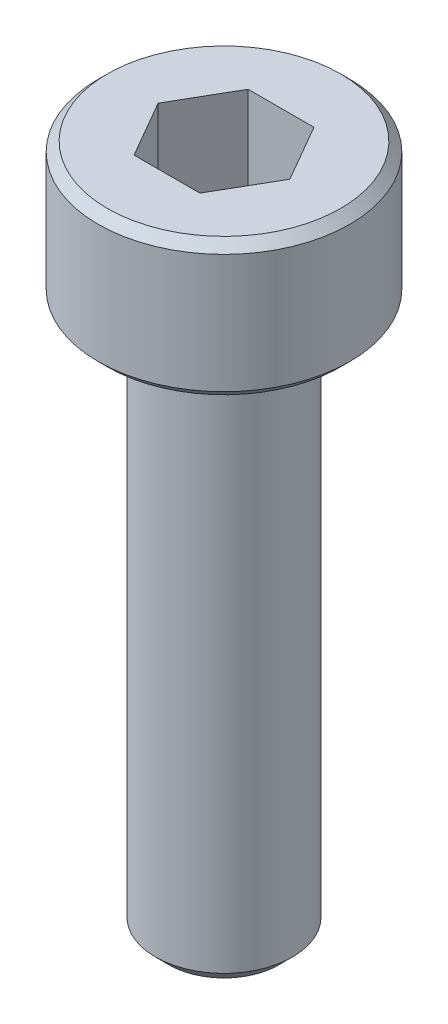
ISO-10303-21;
HEADER;
FILE_DESCRIPTION(('STEP AP214'),'2;1');
FILE_NAME('part.step','',(''),(''),'','','');
FILE_SCHEMA(('AUTOMOTIVE_DESIGN { 1 0 10303 214 1 1 1 1 }'));
ENDSEC;
DATA;
#1=APPLICATION_CONTEXT('core data for automotive mechanical design processes');
#2=APPLICATION_PROTOCOL_DEFINITION('international standard','automotive_design',2000,#1);
#3=PRODUCT_CONTEXT('',#1,'mechanical');
#4=PRODUCT('Part','Part','',(#3));
#5=PRODUCT_RELATED_PRODUCT_CATEGORY('part','',(#4));
#6=PRODUCT_DEFINITION_FORMATION('','',#4);
#7=PRODUCT_DEFINITION_CONTEXT('part definition',#1,'design');
#8=PRODUCT_DEFINITION('design','',#6,#7);
#9=PRODUCT_DEFINITION_SHAPE('','',#8);
#10=(LENGTH_UNIT() NAMED_UNIT(*) SI_UNIT(.MILLI.,.METRE.));
#11=(NAMED_UNIT(*) PLANE_ANGLE_UNIT() SI_UNIT($,.RADIAN.));
#12=(NAMED_UNIT(*) SI_UNIT($,.STERADIAN.) SOLID_ANGLE_UNIT());
#13=UNCERTAINTY_MEASURE_WITH_UNIT(LENGTH_MEASURE(1.E-05),#10,'distance_accuracy_value','');
#14=(GEOMETRIC_REPRESENTATION_CONTEXT(3) GLOBAL_UNCERTAINTY_ASSIGNED_CONTEXT((#13)) GLOBAL_UNIT_ASSIGNED_CONTEXT((#10,
#11,#12)) REPRESENTATION_CONTEXT('',''));
#15=CARTESIAN_POINT('',(0.,0.,0.));
#16=DIRECTION('',(0.,0.,1.));
#17=DIRECTION('',(1.,0.,0.));
#18=AXIS2_PLACEMENT_3D('',#15,#16,#17);
#19=CARTESIAN_POINT('',(1.5,-12.,0.));
#20=DIRECTION('',(0.,1.,0.));
#21=DIRECTION('',(0.,0.,1.));
#22=AXIS2_PLACEMENT_3D('',#19,#20,#21);
#23=PLANE('',#22);
#24=CARTESIAN_POINT('',(0.,-12.,0.));
#25=DIRECTION('',(0.,1.,0.));
#26=DIRECTION('',(0.,0.,1.));
#27=AXIS2_PLACEMENT_3D('',#24,#25,#26);
#28=CIRCLE('',#27,1.2);
#29=CARTESIAN_POINT('',(0.,-12.,1.2));
#30=VERTEX_POINT('',#29);
#31=EDGE_CURVE('E11',#30,#30,#28,.F.);
#32=ORIENTED_EDGE('',*,*,#31,.T.);
#33=EDGE_LOOP('',(#32));
#34=FACE_BOUND('',#33,.T.);
#35=ADVANCED_FACE('F41',(#34),#23,.F.);
#36=CARTESIAN_POINT('',(0.,3.,0.));
#37=DIRECTION('',(0.,1.,0.));
#38=DIRECTION('',(0.,0.,1.));
#39=AXIS2_PLACEMENT_3D('',#36,#37,#38);
#40=CYLINDRICAL_SURFACE('',#39,1.5);
#41=CARTESIAN_POINT('',(0.,-11.7,0.));
#42=DIRECTION('',(0.,1.,0.));
#43=DIRECTION('',(0.,0.,1.));
#44=AXIS2_PLACEMENT_3D('',#41,#42,#43);
#45=CIRCLE('',#44,1.5);
#46=CARTESIAN_POINT('',(0.,-11.7,1.5));
#47=VERTEX_POINT('',#46);
#48=EDGE_CURVE('E51',#47,#47,#45,.T.);
#49=ORIENTED_EDGE('',*,*,#48,.T.);
#50=EDGE_LOOP('',(#49));
#51=FACE_BOUND('',#50,.T.);
#52=CARTESIAN_POINT('',(0.,0.,0.));
#53=DIRECTION('',(0.,1.,0.));
#54=DIRECTION('',(0.,0.,1.));
#55=AXIS2_PLACEMENT_3D('',#52,#53,#54);
#56=CIRCLE('',#55,1.5);
#57=CARTESIAN_POINT('',(0.,0.,1.5));
#58=VERTEX_POINT('',#57);
#59=EDGE_CURVE('E157',#58,#58,#56,.T.);
#60=ORIENTED_EDGE('',*,*,#59,.F.);
#61=EDGE_LOOP('',(#60));
#62=FACE_BOUND('',#61,.T.);
#63=ADVANCED_FACE('F189',(#51,#62),#40,.T.);
#64=CARTESIAN_POINT('',(1.5,0.,0.));
#65=DIRECTION('',(0.,1.,0.));
#66=DIRECTION('',(0.,0.,1.));
#67=AXIS2_PLACEMENT_3D('',#64,#65,#66);
#68=PLANE('',#67);
#69=CARTESIAN_POINT('',(0.,0.,0.));
#70=DIRECTION('',(0.,1.,0.));
#71=DIRECTION('',(0.,0.,1.));
#72=AXIS2_PLACEMENT_3D('',#69,#70,#71);
#73=CIRCLE('',#72,2.55);
#74=CARTESIAN_POINT('',(0.,0.,2.55));
#75=VERTEX_POINT('',#74);
#76=EDGE_CURVE('E178',#75,#75,#73,.F.);
#77=ORIENTED_EDGE('',*,*,#76,.T.);
#78=EDGE_LOOP('',(#77));
#79=FACE_BOUND('',#78,.T.);
#80=ORIENTED_EDGE('',*,*,#59,.T.);
#81=EDGE_LOOP('',(#80));
#82=FACE_BOUND('',#81,.T.);
#83=ADVANCED_FACE('F211',(#79,#82),#68,.F.);
#84=CARTESIAN_POINT('',(0.,3.,0.));
#85=DIRECTION('',(0.,1.,0.));
#86=DIRECTION('',(0.,0.,1.));
#87=AXIS2_PLACEMENT_3D('',#84,#85,#86);
#88=CYLINDRICAL_SURFACE('',#87,2.75);
#89=CARTESIAN_POINT('',(0.,0.199999999999999,0.));
#90=DIRECTION('',(0.,1.,0.));
#91=DIRECTION('',(0.,0.,1.));
#92=AXIS2_PLACEMENT_3D('',#89,#90,#91);
#93=CIRCLE('',#92,2.75);
#94=CARTESIAN_POINT('',(0.,0.199999999999999,2.75));
#95=VERTEX_POINT('',#94);
#96=EDGE_CURVE('E174',#95,#95,#93,.T.);
#97=ORIENTED_EDGE('',*,*,#96,.T.);
#98=EDGE_LOOP('',(#97));
#99=FACE_BOUND('',#98,.T.);
#100=CARTESIAN_POINT('',(0.,2.8,0.));
#101=DIRECTION('',(0.,-1.,0.));
#102=DIRECTION('',(0.,0.,-1.));
#103=AXIS2_PLACEMENT_3D('',#100,#101,#102);
#104=CIRCLE('',#103,2.75);
#105=CARTESIAN_POINT('',(0.,2.8,-2.75));
#106=VERTEX_POINT('',#105);
#107=EDGE_CURVE('E170',#106,#106,#104,.T.);
#108=ORIENTED_EDGE('',*,*,#107,.T.);
#109=EDGE_LOOP('',(#108));
#110=FACE_BOUND('',#109,.T.);
#111=ADVANCED_FACE('F229',(#99,#110),#88,.T.);
#112=CARTESIAN_POINT('',(2.75,3.,0.));
#113=DIRECTION('',(0.,-1.,0.));
#114=DIRECTION('',(0.,0.,-1.));
#115=AXIS2_PLACEMENT_3D('',#112,#113,#114);
#116=PLANE('',#115);
#117=DIRECTION('',(0.5,0.,0.866025403784439));
#118=VECTOR('',#117,1.);
#119=CARTESIAN_POINT('',(-0.72,3.,1.24707658144959));
#120=LINE('',#119,#118);
#121=CARTESIAN_POINT('',(-1.44,3.,0.));
#122=VERTEX_POINT('',#121);
#123=CARTESIAN_POINT('',(-0.72,3.,1.24707658144959));
#124=VERTEX_POINT('',#123);
#125=EDGE_CURVE('E138',#122,#124,#120,.T.);
#126=ORIENTED_EDGE('',*,*,#125,.F.);
#127=DIRECTION('',(-0.5,0.,0.866025403784439));
#128=VECTOR('',#127,1.);
#129=CARTESIAN_POINT('',(-1.44,3.,0.));
#130=LINE('',#129,#128);
#131=CARTESIAN_POINT('',(-0.72,3.,-1.24707658144959));
#132=VERTEX_POINT('',#131);
#133=EDGE_CURVE('E58',#132,#122,#130,.T.);
#134=ORIENTED_EDGE('',*,*,#133,.F.);
#135=DIRECTION('',(-1.,0.,0.));
#136=VECTOR('',#135,1.);
#137=CARTESIAN_POINT('',(-0.72,3.,-1.24707658144959));
#138=LINE('',#137,#136);
#139=CARTESIAN_POINT('',(0.72,3.,-1.24707658144959));
#140=VERTEX_POINT('',#139);
#141=EDGE_CURVE('E151',#140,#132,#138,.T.);
#142=ORIENTED_EDGE('',*,*,#141,.F.);
#143=DIRECTION('',(-0.5,0.,-0.866025403784439));
#144=VECTOR('',#143,1.);
#145=CARTESIAN_POINT('',(0.72,3.,-1.24707658144959));
#146=LINE('',#145,#144);
#147=CARTESIAN_POINT('',(1.44,3.,0.));
#148=VERTEX_POINT('',#147);
#149=EDGE_CURVE('E148',#148,#140,#146,.T.);
#150=ORIENTED_EDGE('',*,*,#149,.F.);
#151=DIRECTION('',(0.5,0.,-0.866025403784439));
#152=VECTOR('',#151,1.);
#153=CARTESIAN_POINT('',(1.44,3.,0.));
#154=LINE('',#153,#152);
#155=CARTESIAN_POINT('',(0.72,3.,1.24707658144959));
#156=VERTEX_POINT('',#155);
#157=EDGE_CURVE('E106',#156,#148,#154,.T.);
#158=ORIENTED_EDGE('',*,*,#157,.F.);
#159=DIRECTION('',(1.,0.,0.));
#160=VECTOR('',#159,1.);
#161=CARTESIAN_POINT('',(0.72,3.,1.24707658144959));
#162=LINE('',#161,#160);
#163=EDGE_CURVE('E142',#124,#156,#162,.T.);
#164=ORIENTED_EDGE('',*,*,#163,.F.);
#165=EDGE_LOOP('',(#126,#134,#142,#150,#158,#164));
#166=FACE_BOUND('',#165,.T.);
#167=CARTESIAN_POINT('',(0.,3.,0.));
#168=DIRECTION('',(0.,-1.,0.));
#169=DIRECTION('',(0.,0.,-1.));
#170=AXIS2_PLACEMENT_3D('',#167,#168,#169);
#171=CIRCLE('',#170,2.55);
#172=CARTESIAN_POINT('',(0.,3.,-2.55));
#173=VERTEX_POINT('',#172);
#174=EDGE_CURVE('E182',#173,#173,#171,.F.);
#175=ORIENTED_EDGE('',*,*,#174,.T.);
#176=EDGE_LOOP('',(#175));
#177=FACE_BOUND('',#176,.T.);
#178=ADVANCED_FACE('F220',(#166,#177),#116,.F.);
#179=CARTESIAN_POINT('',(0.,0.199999999999999,0.));
#180=DIRECTION('',(0.,1.,0.));
#181=DIRECTION('',(0.,0.,1.));
#182=AXIS2_PLACEMENT_3D('',#179,#180,#181);
#183=CONICAL_SURFACE('',#182,2.75,0.785398163397446);
#184=ORIENTED_EDGE('',*,*,#76,.F.);
#185=EDGE_LOOP('',(#184));
#186=FACE_BOUND('',#185,.T.);
#187=ORIENTED_EDGE('',*,*,#96,.F.);
#188=EDGE_LOOP('',(#187));
#189=FACE_BOUND('',#188,.T.);
#190=ADVANCED_FACE('F202',(#186,#189),#183,.T.);
#191=CARTESIAN_POINT('',(0.,3.,0.));
#192=DIRECTION('',(0.,-1.,0.));
#193=DIRECTION('',(0.,0.,-1.));
#194=AXIS2_PLACEMENT_3D('',#191,#192,#193);
#195=CONICAL_SURFACE('',#194,2.55,0.785398163397446);
#196=ORIENTED_EDGE('',*,*,#107,.F.);
#197=EDGE_LOOP('',(#196));
#198=FACE_BOUND('',#197,.T.);
#199=ORIENTED_EDGE('',*,*,#174,.F.);
#200=EDGE_LOOP('',(#199));
#201=FACE_BOUND('',#200,.T.);
#202=ADVANCED_FACE('F194',(#198,#201),#195,.T.);
#203=CARTESIAN_POINT('',(0.,-11.7,0.));
#204=DIRECTION('',(0.,1.,0.));
#205=DIRECTION('',(0.,0.,1.));
#206=AXIS2_PLACEMENT_3D('',#203,#204,#205);
#207=CONICAL_SURFACE('',#206,1.5,0.785398163397454);
#208=ORIENTED_EDGE('',*,*,#31,.F.);
#209=EDGE_LOOP('',(#208));
#210=FACE_BOUND('',#209,.T.);
#211=ORIENTED_EDGE('',*,*,#48,.F.);
#212=EDGE_LOOP('',(#211));
#213=FACE_BOUND('',#212,.T.);
#214=ADVANCED_FACE('F44',(#210,#213),#207,.T.);
#215=CARTESIAN_POINT('',(-1.44,0.5,0.));
#216=DIRECTION('',(-0.866025403784439,0.,-0.5));
#217=DIRECTION('',(-0.5,0.,0.866025403784439));
#218=AXIS2_PLACEMENT_3D('',#215,#216,#217);
#219=PLANE('',#218);
#220=ORIENTED_EDGE('',*,*,#133,.T.);
#221=DIRECTION('',(0.,1.,0.));
#222=VECTOR('',#221,1.);
#223=CARTESIAN_POINT('',(-1.44,0.5,0.));
#224=LINE('',#223,#222);
#225=CARTESIAN_POINT('',(-1.44,0.5,0.));
#226=VERTEX_POINT('',#225);
#227=EDGE_CURVE('E88',#226,#122,#224,.T.);
#228=ORIENTED_EDGE('',*,*,#227,.F.);
#229=DIRECTION('',(-0.5,0.,0.866025403784439));
#230=VECTOR('',#229,1.);
#231=CARTESIAN_POINT('',(-1.44,0.5,0.));
#232=LINE('',#231,#230);
#233=CARTESIAN_POINT('',(-0.72,0.5,-1.24707658144959));
#234=VERTEX_POINT('',#233);
#235=EDGE_CURVE('E154',#234,#226,#232,.T.);
#236=ORIENTED_EDGE('',*,*,#235,.F.);
#237=DIRECTION('',(0.,1.,0.));
#238=VECTOR('',#237,1.);
#239=CARTESIAN_POINT('',(-0.72,0.5,-1.24707658144959));
#240=LINE('',#239,#238);
#241=EDGE_CURVE('E66',#234,#132,#240,.T.);
#242=ORIENTED_EDGE('',*,*,#241,.T.);
#243=EDGE_LOOP('',(#220,#228,#236,#242));
#244=FACE_BOUND('',#243,.T.);
#245=ADVANCED_FACE('F193',(#244),#219,.F.);
#246=CARTESIAN_POINT('',(-0.72,0.5,-1.24707658144959));
#247=DIRECTION('',(0.,0.,-1.));
#248=DIRECTION('',(-1.,0.,0.));
#249=AXIS2_PLACEMENT_3D('',#246,#247,#248);
#250=PLANE('',#249);
#251=ORIENTED_EDGE('',*,*,#141,.T.);
#252=ORIENTED_EDGE('',*,*,#241,.F.);
#253=DIRECTION('',(-1.,0.,0.));
#254=VECTOR('',#253,1.);
#255=CARTESIAN_POINT('',(-0.72,0.5,-1.24707658144959));
#256=LINE('',#255,#254);
#257=CARTESIAN_POINT('',(0.72,0.5,-1.24707658144959));
#258=VERTEX_POINT('',#257);
#259=EDGE_CURVE('E120',#258,#234,#256,.T.);
#260=ORIENTED_EDGE('',*,*,#259,.F.);
#261=DIRECTION('',(0.,1.,0.));
#262=VECTOR('',#261,1.);
#263=CARTESIAN_POINT('',(0.72,0.5,-1.24707658144959));
#264=LINE('',#263,#262);
#265=EDGE_CURVE('E111',#258,#140,#264,.T.);
#266=ORIENTED_EDGE('',*,*,#265,.T.);
#267=EDGE_LOOP('',(#251,#252,#260,#266));
#268=FACE_BOUND('',#267,.T.);
#269=ADVANCED_FACE('F200',(#268),#250,.F.);
#270=CARTESIAN_POINT('',(0.72,0.5,-1.24707658144959));
#271=DIRECTION('',(0.866025403784439,0.,-0.5));
#272=DIRECTION('',(-0.5,0.,-0.866025403784439));
#273=AXIS2_PLACEMENT_3D('',#270,#271,#272);
#274=PLANE('',#273);
#275=ORIENTED_EDGE('',*,*,#149,.T.);
#276=ORIENTED_EDGE('',*,*,#265,.F.);
#277=DIRECTION('',(-0.5,0.,-0.866025403784439));
#278=VECTOR('',#277,1.);
#279=CARTESIAN_POINT('',(0.72,0.5,-1.24707658144959));
#280=LINE('',#279,#278);
#281=CARTESIAN_POINT('',(1.44,0.5,0.));
#282=VERTEX_POINT('',#281);
#283=EDGE_CURVE('E115',#282,#258,#280,.T.);
#284=ORIENTED_EDGE('',*,*,#283,.F.);
#285=DIRECTION('',(0.,1.,0.));
#286=VECTOR('',#285,1.);
#287=CARTESIAN_POINT('',(1.44,0.5,0.));
#288=LINE('',#287,#286);
#289=EDGE_CURVE('E99',#282,#148,#288,.T.);
#290=ORIENTED_EDGE('',*,*,#289,.T.);
#291=EDGE_LOOP('',(#275,#276,#284,#290));
#292=FACE_BOUND('',#291,.T.);
#293=ADVANCED_FACE('F116',(#292),#274,.F.);
#294=CARTESIAN_POINT('',(1.44,0.5,0.));
#295=DIRECTION('',(0.866025403784439,0.,0.5));
#296=DIRECTION('',(0.5,0.,-0.866025403784439));
#297=AXIS2_PLACEMENT_3D('',#294,#295,#296);
#298=PLANE('',#297);
#299=ORIENTED_EDGE('',*,*,#157,.T.);
#300=ORIENTED_EDGE('',*,*,#289,.F.);
#301=DIRECTION('',(0.5,0.,-0.866025403784439));
#302=VECTOR('',#301,1.);
#303=CARTESIAN_POINT('',(1.44,0.5,0.));
#304=LINE('',#303,#302);
#305=CARTESIAN_POINT('',(0.72,0.5,1.24707658144959));
#306=VERTEX_POINT('',#305);
#307=EDGE_CURVE('E103',#306,#282,#304,.T.);
#308=ORIENTED_EDGE('',*,*,#307,.F.);
#309=DIRECTION('',(0.,1.,0.));
#310=VECTOR('',#309,1.);
#311=CARTESIAN_POINT('',(0.72,0.5,1.24707658144959));
#312=LINE('',#311,#310);
#313=EDGE_CURVE('E112',#306,#156,#312,.T.);
#314=ORIENTED_EDGE('',*,*,#313,.T.);
#315=EDGE_LOOP('',(#299,#300,#308,#314));
#316=FACE_BOUND('',#315,.T.);
#317=ADVANCED_FACE('F101',(#316),#298,.F.);
#318=CARTESIAN_POINT('',(0.72,0.5,1.24707658144959));
#319=DIRECTION('',(0.,0.,1.));
#320=DIRECTION('',(1.,0.,0.));
#321=AXIS2_PLACEMENT_3D('',#318,#319,#320);
#322=PLANE('',#321);
#323=ORIENTED_EDGE('',*,*,#163,.T.);
#324=ORIENTED_EDGE('',*,*,#313,.F.);
#325=DIRECTION('',(1.,0.,0.));
#326=VECTOR('',#325,1.);
#327=CARTESIAN_POINT('',(0.72,0.5,1.24707658144959));
#328=LINE('',#327,#326);
#329=CARTESIAN_POINT('',(-0.72,0.5,1.24707658144959));
#330=VERTEX_POINT('',#329);
#331=EDGE_CURVE('E126',#330,#306,#328,.T.);
#332=ORIENTED_EDGE('',*,*,#331,.F.);
#333=DIRECTION('',(0.,1.,0.));
#334=VECTOR('',#333,1.);
#335=CARTESIAN_POINT('',(-0.72,0.5,1.24707658144959));
#336=LINE('',#335,#334);
#337=EDGE_CURVE('E162',#330,#124,#336,.T.);
#338=ORIENTED_EDGE('',*,*,#337,.T.);
#339=EDGE_LOOP('',(#323,#324,#332,#338));
#340=FACE_BOUND('',#339,.T.);
#341=ADVANCED_FACE('F251',(#340),#322,.F.);
#342=CARTESIAN_POINT('',(-0.72,0.5,1.24707658144959));
#343=DIRECTION('',(-0.866025403784439,0.,0.5));
#344=DIRECTION('',(0.5,0.,0.866025403784439));
#345=AXIS2_PLACEMENT_3D('',#342,#343,#344);
#346=PLANE('',#345);
#347=ORIENTED_EDGE('',*,*,#125,.T.);
#348=ORIENTED_EDGE('',*,*,#337,.F.);
#349=DIRECTION('',(0.5,0.,0.866025403784439));
#350=VECTOR('',#349,1.);
#351=CARTESIAN_POINT('',(-0.72,0.5,1.24707658144959));
#352=LINE('',#351,#350);
#353=EDGE_CURVE('E130',#226,#330,#352,.T.);
#354=ORIENTED_EDGE('',*,*,#353,.F.);
#355=ORIENTED_EDGE('',*,*,#227,.T.);
#356=EDGE_LOOP('',(#347,#348,#354,#355));
#357=FACE_BOUND('',#356,.T.);
#358=ADVANCED_FACE('F248',(#357),#346,.F.);
#359=CARTESIAN_POINT('',(0.,0.5,0.));
#360=DIRECTION('',(0.,-1.,0.));
#361=DIRECTION('',(0.,0.,-1.));
#362=AXIS2_PLACEMENT_3D('',#359,#360,#361);
#363=PLANE('',#362);
#364=ORIENTED_EDGE('',*,*,#235,.T.);
#365=ORIENTED_EDGE('',*,*,#353,.T.);
#366=ORIENTED_EDGE('',*,*,#331,.T.);
#367=ORIENTED_EDGE('',*,*,#307,.T.);
#368=ORIENTED_EDGE('',*,*,#283,.T.);
#369=ORIENTED_EDGE('',*,*,#259,.T.);
#370=EDGE_LOOP('',(#364,#365,#366,#367,#368,#369));
#371=FACE_BOUND('',#370,.T.);
#372=ADVANCED_FACE('F123',(#371),#363,.F.);
#373=CLOSED_SHELL('',(#35,#63,#83,#111,#178,#190,#202,#214,#245,#269,#293,#317,#341,#358,#372));
#374=MANIFOLD_SOLID_BREP('B2',#373);
#375=ADVANCED_BREP_SHAPE_REPRESENTATION('',(#18,#374),#14);
#376=SHAPE_DEFINITION_REPRESENTATION(#9,#375);
ENDSEC;
END-ISO-10303-21;
